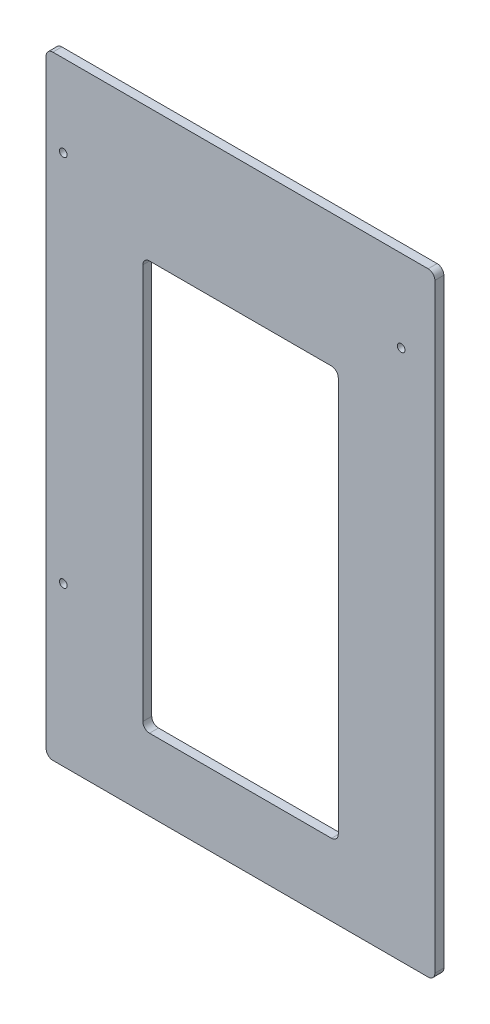
ISO-10303-21;
HEADER;
FILE_DESCRIPTION(('STEP AP214'),'2;1');
FILE_NAME('part.step','',(''),(''),'','','');
FILE_SCHEMA(('AUTOMOTIVE_DESIGN { 1 0 10303 214 1 1 1 1 }'));
ENDSEC;
DATA;
#1=APPLICATION_CONTEXT('core data for automotive mechanical design processes');
#2=APPLICATION_PROTOCOL_DEFINITION('international standard','automotive_design',2000,#1);
#3=PRODUCT_CONTEXT('',#1,'mechanical');
#4=PRODUCT('Part','Part','',(#3));
#5=PRODUCT_RELATED_PRODUCT_CATEGORY('part','',(#4));
#6=PRODUCT_DEFINITION_FORMATION('','',#4);
#7=PRODUCT_DEFINITION_CONTEXT('part definition',#1,'design');
#8=PRODUCT_DEFINITION('design','',#6,#7);
#9=PRODUCT_DEFINITION_SHAPE('','',#8);
#10=(LENGTH_UNIT() NAMED_UNIT(*) SI_UNIT(.MILLI.,.METRE.));
#11=(NAMED_UNIT(*) PLANE_ANGLE_UNIT() SI_UNIT($,.RADIAN.));
#12=(NAMED_UNIT(*) SI_UNIT($,.STERADIAN.) SOLID_ANGLE_UNIT());
#13=UNCERTAINTY_MEASURE_WITH_UNIT(LENGTH_MEASURE(1.E-05),#10,'distance_accuracy_value','');
#14=(GEOMETRIC_REPRESENTATION_CONTEXT(3) GLOBAL_UNCERTAINTY_ASSIGNED_CONTEXT((#13)) GLOBAL_UNIT_ASSIGNED_CONTEXT((#10,
#11,#12)) REPRESENTATION_CONTEXT('',''));
#15=CARTESIAN_POINT('',(0.,0.,0.));
#16=DIRECTION('',(0.,0.,1.));
#17=DIRECTION('',(1.,0.,0.));
#18=AXIS2_PLACEMENT_3D('',#15,#16,#17);
#19=CARTESIAN_POINT('',(0.,0.,0.));
#20=DIRECTION('',(0.,0.,-1.));
#21=DIRECTION('',(-1.,0.,0.));
#22=AXIS2_PLACEMENT_3D('',#19,#20,#21);
#23=PLANE('',#22);
#24=CARTESIAN_POINT('',(7.62,236.5,0.));
#25=DIRECTION('',(0.,0.,1.));
#26=DIRECTION('',(1.,0.,0.));
#27=AXIS2_PLACEMENT_3D('',#24,#25,#26);
#28=CIRCLE('',#27,1.7);
#29=CARTESIAN_POINT('',(9.32,236.5,0.));
#30=VERTEX_POINT('',#29);
#31=EDGE_CURVE('E511',#30,#30,#28,.T.);
#32=ORIENTED_EDGE('',*,*,#31,.T.);
#33=EDGE_LOOP('',(#32));
#34=FACE_BOUND('',#33,.T.);
#35=CARTESIAN_POINT('',(7.62,70.5,0.));
#36=DIRECTION('',(0.,0.,1.));
#37=DIRECTION('',(1.,0.,0.));
#38=AXIS2_PLACEMENT_3D('',#35,#36,#37);
#39=CIRCLE('',#38,1.7);
#40=CARTESIAN_POINT('',(9.32,70.5,0.));
#41=VERTEX_POINT('',#40);
#42=EDGE_CURVE('E524',#41,#41,#39,.T.);
#43=ORIENTED_EDGE('',*,*,#42,.T.);
#44=EDGE_LOOP('',(#43));
#45=FACE_BOUND('',#44,.T.);
#46=DIRECTION('',(1.,0.,0.));
#47=VECTOR('',#46,1.);
#48=CARTESIAN_POINT('',(0.,0.,0.));
#49=LINE('',#48,#47);
#50=CARTESIAN_POINT('',(3.,0.,0.));
#51=VERTEX_POINT('',#50);
#52=CARTESIAN_POINT('',(170.,0.,0.));
#53=VERTEX_POINT('',#52);
#54=EDGE_CURVE('E325',#51,#53,#49,.T.);
#55=ORIENTED_EDGE('',*,*,#54,.F.);
#56=CARTESIAN_POINT('',(3.,3.,0.));
#57=DIRECTION('',(0.,0.,-1.));
#58=DIRECTION('',(-1.,0.,0.));
#59=AXIS2_PLACEMENT_3D('',#56,#57,#58);
#60=CIRCLE('',#59,3.);
#61=CARTESIAN_POINT('',(0.,3.,0.));
#62=VERTEX_POINT('',#61);
#63=EDGE_CURVE('E228',#51,#62,#60,.T.);
#64=ORIENTED_EDGE('',*,*,#63,.T.);
#65=DIRECTION('',(0.,-1.,0.));
#66=VECTOR('',#65,1.);
#67=CARTESIAN_POINT('',(0.,0.,0.));
#68=LINE('',#67,#66);
#69=CARTESIAN_POINT('',(0.,270.,0.));
#70=VERTEX_POINT('',#69);
#71=EDGE_CURVE('E321',#70,#62,#68,.T.);
#72=ORIENTED_EDGE('',*,*,#71,.F.);
#73=CARTESIAN_POINT('',(3.,270.,0.));
#74=DIRECTION('',(0.,0.,-1.));
#75=DIRECTION('',(-1.,0.,0.));
#76=AXIS2_PLACEMENT_3D('',#73,#74,#75);
#77=CIRCLE('',#76,3.);
#78=CARTESIAN_POINT('',(3.,273.,0.));
#79=VERTEX_POINT('',#78);
#80=EDGE_CURVE('E219',#70,#79,#77,.T.);
#81=ORIENTED_EDGE('',*,*,#80,.T.);
#82=DIRECTION('',(-1.,0.,0.));
#83=VECTOR('',#82,1.);
#84=CARTESIAN_POINT('',(0.,273.,0.));
#85=LINE('',#84,#83);
#86=CARTESIAN_POINT('',(170.,273.,0.));
#87=VERTEX_POINT('',#86);
#88=EDGE_CURVE('E190',#87,#79,#85,.T.);
#89=ORIENTED_EDGE('',*,*,#88,.F.);
#90=CARTESIAN_POINT('',(170.,270.,0.));
#91=DIRECTION('',(0.,0.,-1.));
#92=DIRECTION('',(-1.,0.,0.));
#93=AXIS2_PLACEMENT_3D('',#90,#91,#92);
#94=CIRCLE('',#93,3.);
#95=CARTESIAN_POINT('',(173.,270.,0.));
#96=VERTEX_POINT('',#95);
#97=EDGE_CURVE('E222',#87,#96,#94,.T.);
#98=ORIENTED_EDGE('',*,*,#97,.T.);
#99=DIRECTION('',(0.,1.,0.));
#100=VECTOR('',#99,1.);
#101=CARTESIAN_POINT('',(173.,0.,0.));
#102=LINE('',#101,#100);
#103=CARTESIAN_POINT('',(173.,3.,0.));
#104=VERTEX_POINT('',#103);
#105=EDGE_CURVE('E328',#104,#96,#102,.T.);
#106=ORIENTED_EDGE('',*,*,#105,.F.);
#107=CARTESIAN_POINT('',(170.,3.,0.));
#108=DIRECTION('',(0.,0.,-1.));
#109=DIRECTION('',(-1.,0.,0.));
#110=AXIS2_PLACEMENT_3D('',#107,#108,#109);
#111=CIRCLE('',#110,3.);
#112=EDGE_CURVE('E225',#104,#53,#111,.T.);
#113=ORIENTED_EDGE('',*,*,#112,.T.);
#114=EDGE_LOOP('',(#55,#64,#72,#81,#89,#98,#106,#113));
#115=FACE_BOUND('',#114,.T.);
#116=DIRECTION('',(0.,1.,0.));
#117=VECTOR('',#116,1.);
#118=CARTESIAN_POINT('',(130.,32.,0.));
#119=LINE('',#118,#117);
#120=CARTESIAN_POINT('',(130.,35.,0.));
#121=VERTEX_POINT('',#120);
#122=CARTESIAN_POINT('',(130.,211.,0.));
#123=VERTEX_POINT('',#122);
#124=EDGE_CURVE('E299',#121,#123,#119,.T.);
#125=ORIENTED_EDGE('',*,*,#124,.T.);
#126=CARTESIAN_POINT('',(127.,211.,0.));
#127=DIRECTION('',(0.,0.,-1.));
#128=DIRECTION('',(-1.,0.,0.));
#129=AXIS2_PLACEMENT_3D('',#126,#127,#128);
#130=CIRCLE('',#129,3.);
#131=CARTESIAN_POINT('',(127.,214.,0.));
#132=VERTEX_POINT('',#131);
#133=EDGE_CURVE('E274',#123,#132,#130,.F.);
#134=ORIENTED_EDGE('',*,*,#133,.T.);
#135=DIRECTION('',(-1.,0.,0.));
#136=VECTOR('',#135,1.);
#137=CARTESIAN_POINT('',(43.,214.,0.));
#138=LINE('',#137,#136);
#139=CARTESIAN_POINT('',(46.,214.,0.));
#140=VERTEX_POINT('',#139);
#141=EDGE_CURVE('E159',#132,#140,#138,.T.);
#142=ORIENTED_EDGE('',*,*,#141,.T.);
#143=CARTESIAN_POINT('',(46.,211.,0.));
#144=DIRECTION('',(0.,0.,-1.));
#145=DIRECTION('',(-1.,0.,0.));
#146=AXIS2_PLACEMENT_3D('',#143,#144,#145);
#147=CIRCLE('',#146,3.);
#148=CARTESIAN_POINT('',(43.,211.,0.));
#149=VERTEX_POINT('',#148);
#150=EDGE_CURVE('E48',#140,#149,#147,.F.);
#151=ORIENTED_EDGE('',*,*,#150,.T.);
#152=DIRECTION('',(0.,-1.,0.));
#153=VECTOR('',#152,1.);
#154=CARTESIAN_POINT('',(43.,32.,0.));
#155=LINE('',#154,#153);
#156=CARTESIAN_POINT('',(43.,35.,0.));
#157=VERTEX_POINT('',#156);
#158=EDGE_CURVE('E157',#149,#157,#155,.T.);
#159=ORIENTED_EDGE('',*,*,#158,.T.);
#160=CARTESIAN_POINT('',(46.,35.,0.));
#161=DIRECTION('',(0.,0.,-1.));
#162=DIRECTION('',(-1.,0.,0.));
#163=AXIS2_PLACEMENT_3D('',#160,#161,#162);
#164=CIRCLE('',#163,3.);
#165=CARTESIAN_POINT('',(46.,32.,0.));
#166=VERTEX_POINT('',#165);
#167=EDGE_CURVE('E262',#157,#166,#164,.F.);
#168=ORIENTED_EDGE('',*,*,#167,.T.);
#169=DIRECTION('',(1.,0.,0.));
#170=VECTOR('',#169,1.);
#171=CARTESIAN_POINT('',(43.,32.,0.));
#172=LINE('',#171,#170);
#173=CARTESIAN_POINT('',(127.,32.,0.));
#174=VERTEX_POINT('',#173);
#175=EDGE_CURVE('E175',#166,#174,#172,.T.);
#176=ORIENTED_EDGE('',*,*,#175,.T.);
#177=CARTESIAN_POINT('',(127.,35.,0.));
#178=DIRECTION('',(0.,0.,-1.));
#179=DIRECTION('',(-1.,0.,0.));
#180=AXIS2_PLACEMENT_3D('',#177,#178,#179);
#181=CIRCLE('',#180,3.);
#182=EDGE_CURVE('E268',#174,#121,#181,.F.);
#183=ORIENTED_EDGE('',*,*,#182,.T.);
#184=EDGE_LOOP('',(#125,#134,#142,#151,#159,#168,#176,#183));
#185=FACE_BOUND('',#184,.T.);
#186=CARTESIAN_POINT('',(158.,236.5,0.));
#187=DIRECTION('',(0.,0.,1.));
#188=DIRECTION('',(1.,0.,0.));
#189=AXIS2_PLACEMENT_3D('',#186,#187,#188);
#190=CIRCLE('',#189,1.70000000000001);
#191=CARTESIAN_POINT('',(159.7,236.5,0.));
#192=VERTEX_POINT('',#191);
#193=EDGE_CURVE('E176',#192,#192,#190,.T.);
#194=ORIENTED_EDGE('',*,*,#193,.T.);
#195=EDGE_LOOP('',(#194));
#196=FACE_BOUND('',#195,.T.);
#197=ADVANCED_FACE('F39',(#34,#45,#115,#185,#196),#23,.T.);
#198=CARTESIAN_POINT('',(0.,0.,4.));
#199=DIRECTION('',(0.,0.,-1.));
#200=DIRECTION('',(-1.,0.,0.));
#201=AXIS2_PLACEMENT_3D('',#198,#199,#200);
#202=PLANE('',#201);
#203=CARTESIAN_POINT('',(7.62,236.5,4.));
#204=DIRECTION('',(0.,0.,1.));
#205=DIRECTION('',(1.,0.,0.));
#206=AXIS2_PLACEMENT_3D('',#203,#204,#205);
#207=CIRCLE('',#206,1.69999999999999);
#208=CARTESIAN_POINT('',(9.31999999999999,236.5,4.));
#209=VERTEX_POINT('',#208);
#210=EDGE_CURVE('E514',#209,#209,#207,.T.);
#211=ORIENTED_EDGE('',*,*,#210,.F.);
#212=EDGE_LOOP('',(#211));
#213=FACE_BOUND('',#212,.T.);
#214=CARTESIAN_POINT('',(7.62,70.5,4.));
#215=DIRECTION('',(0.,0.,1.));
#216=DIRECTION('',(1.,0.,0.));
#217=AXIS2_PLACEMENT_3D('',#214,#215,#216);
#218=CIRCLE('',#217,1.69999999999999);
#219=CARTESIAN_POINT('',(9.31999999999999,70.5,4.));
#220=VERTEX_POINT('',#219);
#221=EDGE_CURVE('E518',#220,#220,#218,.T.);
#222=ORIENTED_EDGE('',*,*,#221,.F.);
#223=EDGE_LOOP('',(#222));
#224=FACE_BOUND('',#223,.T.);
#225=CARTESIAN_POINT('',(158.,236.5,4.));
#226=DIRECTION('',(0.,0.,1.));
#227=DIRECTION('',(1.,0.,0.));
#228=AXIS2_PLACEMENT_3D('',#225,#226,#227);
#229=CIRCLE('',#228,1.69999999999998);
#230=CARTESIAN_POINT('',(159.7,236.5,4.));
#231=VERTEX_POINT('',#230);
#232=EDGE_CURVE('E528',#231,#231,#229,.T.);
#233=ORIENTED_EDGE('',*,*,#232,.F.);
#234=EDGE_LOOP('',(#233));
#235=FACE_BOUND('',#234,.T.);
#236=DIRECTION('',(0.,-1.,0.));
#237=VECTOR('',#236,1.);
#238=CARTESIAN_POINT('',(0.,0.,4.));
#239=LINE('',#238,#237);
#240=CARTESIAN_POINT('',(0.,270.,4.));
#241=VERTEX_POINT('',#240);
#242=CARTESIAN_POINT('',(0.,3.,4.));
#243=VERTEX_POINT('',#242);
#244=EDGE_CURVE('E311',#241,#243,#239,.T.);
#245=ORIENTED_EDGE('',*,*,#244,.T.);
#246=CARTESIAN_POINT('',(3.,3.,4.));
#247=DIRECTION('',(0.,0.,-1.));
#248=DIRECTION('',(-1.,0.,0.));
#249=AXIS2_PLACEMENT_3D('',#246,#247,#248);
#250=CIRCLE('',#249,3.);
#251=CARTESIAN_POINT('',(3.,0.,4.));
#252=VERTEX_POINT('',#251);
#253=EDGE_CURVE('E246',#243,#252,#250,.F.);
#254=ORIENTED_EDGE('',*,*,#253,.T.);
#255=DIRECTION('',(1.,0.,0.));
#256=VECTOR('',#255,1.);
#257=CARTESIAN_POINT('',(0.,0.,4.));
#258=LINE('',#257,#256);
#259=CARTESIAN_POINT('',(170.,0.,4.));
#260=VERTEX_POINT('',#259);
#261=EDGE_CURVE('E315',#252,#260,#258,.T.);
#262=ORIENTED_EDGE('',*,*,#261,.T.);
#263=CARTESIAN_POINT('',(170.,3.,4.));
#264=DIRECTION('',(0.,0.,-1.));
#265=DIRECTION('',(-1.,0.,0.));
#266=AXIS2_PLACEMENT_3D('',#263,#264,#265);
#267=CIRCLE('',#266,3.);
#268=CARTESIAN_POINT('',(173.,3.,4.));
#269=VERTEX_POINT('',#268);
#270=EDGE_CURVE('E243',#260,#269,#267,.F.);
#271=ORIENTED_EDGE('',*,*,#270,.T.);
#272=DIRECTION('',(0.,1.,0.));
#273=VECTOR('',#272,1.);
#274=CARTESIAN_POINT('',(173.,0.,4.));
#275=LINE('',#274,#273);
#276=CARTESIAN_POINT('',(173.,270.,4.));
#277=VERTEX_POINT('',#276);
#278=EDGE_CURVE('E187',#269,#277,#275,.T.);
#279=ORIENTED_EDGE('',*,*,#278,.T.);
#280=CARTESIAN_POINT('',(170.,270.,4.));
#281=DIRECTION('',(0.,0.,-1.));
#282=DIRECTION('',(-1.,0.,0.));
#283=AXIS2_PLACEMENT_3D('',#280,#281,#282);
#284=CIRCLE('',#283,3.);
#285=CARTESIAN_POINT('',(170.,273.,4.));
#286=VERTEX_POINT('',#285);
#287=EDGE_CURVE('E62',#277,#286,#284,.F.);
#288=ORIENTED_EDGE('',*,*,#287,.T.);
#289=DIRECTION('',(-1.,0.,0.));
#290=VECTOR('',#289,1.);
#291=CARTESIAN_POINT('',(0.,273.,4.));
#292=LINE('',#291,#290);
#293=CARTESIAN_POINT('',(3.,273.,4.));
#294=VERTEX_POINT('',#293);
#295=EDGE_CURVE('E181',#286,#294,#292,.T.);
#296=ORIENTED_EDGE('',*,*,#295,.T.);
#297=CARTESIAN_POINT('',(3.,270.,4.));
#298=DIRECTION('',(0.,0.,-1.));
#299=DIRECTION('',(-1.,0.,0.));
#300=AXIS2_PLACEMENT_3D('',#297,#298,#299);
#301=CIRCLE('',#300,3.);
#302=EDGE_CURVE('E238',#294,#241,#301,.F.);
#303=ORIENTED_EDGE('',*,*,#302,.T.);
#304=EDGE_LOOP('',(#245,#254,#262,#271,#279,#288,#296,#303));
#305=FACE_BOUND('',#304,.T.);
#306=DIRECTION('',(0.,-1.,0.));
#307=VECTOR('',#306,1.);
#308=CARTESIAN_POINT('',(43.,32.,4.));
#309=LINE('',#308,#307);
#310=CARTESIAN_POINT('',(43.,211.,4.));
#311=VERTEX_POINT('',#310);
#312=CARTESIAN_POINT('',(43.,35.,4.));
#313=VERTEX_POINT('',#312);
#314=EDGE_CURVE('E303',#311,#313,#309,.T.);
#315=ORIENTED_EDGE('',*,*,#314,.F.);
#316=CARTESIAN_POINT('',(46.,211.,4.));
#317=DIRECTION('',(0.,0.,-1.));
#318=DIRECTION('',(-1.,0.,0.));
#319=AXIS2_PLACEMENT_3D('',#316,#317,#318);
#320=CIRCLE('',#319,3.);
#321=CARTESIAN_POINT('',(46.,214.,4.));
#322=VERTEX_POINT('',#321);
#323=EDGE_CURVE('E11',#311,#322,#320,.T.);
#324=ORIENTED_EDGE('',*,*,#323,.T.);
#325=DIRECTION('',(-1.,0.,0.));
#326=VECTOR('',#325,1.);
#327=CARTESIAN_POINT('',(43.,214.,4.));
#328=LINE('',#327,#326);
#329=CARTESIAN_POINT('',(127.,214.,4.));
#330=VERTEX_POINT('',#329);
#331=EDGE_CURVE('E287',#330,#322,#328,.T.);
#332=ORIENTED_EDGE('',*,*,#331,.F.);
#333=CARTESIAN_POINT('',(127.,211.,4.));
#334=DIRECTION('',(0.,0.,-1.));
#335=DIRECTION('',(-1.,0.,0.));
#336=AXIS2_PLACEMENT_3D('',#333,#334,#335);
#337=CIRCLE('',#336,3.);
#338=CARTESIAN_POINT('',(130.,211.,4.));
#339=VERTEX_POINT('',#338);
#340=EDGE_CURVE('E165',#330,#339,#337,.T.);
#341=ORIENTED_EDGE('',*,*,#340,.T.);
#342=DIRECTION('',(0.,1.,0.));
#343=VECTOR('',#342,1.);
#344=CARTESIAN_POINT('',(130.,32.,4.));
#345=LINE('',#344,#343);
#346=CARTESIAN_POINT('',(130.,35.,4.));
#347=VERTEX_POINT('',#346);
#348=EDGE_CURVE('E284',#347,#339,#345,.T.);
#349=ORIENTED_EDGE('',*,*,#348,.F.);
#350=CARTESIAN_POINT('',(127.,35.,4.));
#351=DIRECTION('',(0.,0.,-1.));
#352=DIRECTION('',(-1.,0.,0.));
#353=AXIS2_PLACEMENT_3D('',#350,#351,#352);
#354=CIRCLE('',#353,3.);
#355=CARTESIAN_POINT('',(127.,32.,4.));
#356=VERTEX_POINT('',#355);
#357=EDGE_CURVE('E271',#347,#356,#354,.T.);
#358=ORIENTED_EDGE('',*,*,#357,.T.);
#359=DIRECTION('',(1.,0.,0.));
#360=VECTOR('',#359,1.);
#361=CARTESIAN_POINT('',(43.,32.,4.));
#362=LINE('',#361,#360);
#363=CARTESIAN_POINT('',(46.,32.,4.));
#364=VERTEX_POINT('',#363);
#365=EDGE_CURVE('E296',#364,#356,#362,.T.);
#366=ORIENTED_EDGE('',*,*,#365,.F.);
#367=CARTESIAN_POINT('',(46.,35.,4.));
#368=DIRECTION('',(0.,0.,-1.));
#369=DIRECTION('',(-1.,0.,0.));
#370=AXIS2_PLACEMENT_3D('',#367,#368,#369);
#371=CIRCLE('',#370,3.);
#372=EDGE_CURVE('E265',#364,#313,#371,.T.);
#373=ORIENTED_EDGE('',*,*,#372,.T.);
#374=EDGE_LOOP('',(#315,#324,#332,#341,#349,#358,#366,#373));
#375=FACE_BOUND('',#374,.T.);
#376=ADVANCED_FACE('F283',(#213,#224,#235,#305,#375),#202,.F.);
#377=CARTESIAN_POINT('',(0.,0.,4.));
#378=DIRECTION('',(1.,0.,0.));
#379=DIRECTION('',(0.,0.,-1.));
#380=AXIS2_PLACEMENT_3D('',#377,#378,#379);
#381=PLANE('',#380);
#382=ORIENTED_EDGE('',*,*,#71,.T.);
#383=DIRECTION('',(0.,0.,-1.));
#384=VECTOR('',#383,1.);
#385=CARTESIAN_POINT('',(0.,3.,4.));
#386=LINE('',#385,#384);
#387=EDGE_CURVE('E235',#62,#243,#386,.F.);
#388=ORIENTED_EDGE('',*,*,#387,.T.);
#389=ORIENTED_EDGE('',*,*,#244,.F.);
#390=DIRECTION('',(0.,0.,-1.));
#391=VECTOR('',#390,1.);
#392=CARTESIAN_POINT('',(0.,270.,4.));
#393=LINE('',#392,#391);
#394=EDGE_CURVE('E231',#241,#70,#393,.T.);
#395=ORIENTED_EDGE('',*,*,#394,.T.);
#396=EDGE_LOOP('',(#382,#388,#389,#395));
#397=FACE_BOUND('',#396,.T.);
#398=ADVANCED_FACE('F345',(#397),#381,.F.);
#399=CARTESIAN_POINT('',(0.,0.,4.));
#400=DIRECTION('',(0.,1.,0.));
#401=DIRECTION('',(0.,0.,1.));
#402=AXIS2_PLACEMENT_3D('',#399,#400,#401);
#403=PLANE('',#402);
#404=ORIENTED_EDGE('',*,*,#261,.F.);
#405=DIRECTION('',(0.,0.,-1.));
#406=VECTOR('',#405,1.);
#407=CARTESIAN_POINT('',(3.,0.,4.));
#408=LINE('',#407,#406);
#409=EDGE_CURVE('E215',#252,#51,#408,.T.);
#410=ORIENTED_EDGE('',*,*,#409,.T.);
#411=ORIENTED_EDGE('',*,*,#54,.T.);
#412=DIRECTION('',(0.,0.,-1.));
#413=VECTOR('',#412,1.);
#414=CARTESIAN_POINT('',(170.,0.,4.));
#415=LINE('',#414,#413);
#416=EDGE_CURVE('E212',#53,#260,#415,.F.);
#417=ORIENTED_EDGE('',*,*,#416,.T.);
#418=EDGE_LOOP('',(#404,#410,#411,#417));
#419=FACE_BOUND('',#418,.T.);
#420=ADVANCED_FACE('F354',(#419),#403,.F.);
#421=CARTESIAN_POINT('',(173.,0.,4.));
#422=DIRECTION('',(-1.,0.,0.));
#423=DIRECTION('',(0.,0.,1.));
#424=AXIS2_PLACEMENT_3D('',#421,#422,#423);
#425=PLANE('',#424);
#426=ORIENTED_EDGE('',*,*,#278,.F.);
#427=DIRECTION('',(0.,0.,-1.));
#428=VECTOR('',#427,1.);
#429=CARTESIAN_POINT('',(173.,3.,4.));
#430=LINE('',#429,#428);
#431=EDGE_CURVE('E252',#269,#104,#430,.T.);
#432=ORIENTED_EDGE('',*,*,#431,.T.);
#433=ORIENTED_EDGE('',*,*,#105,.T.);
#434=DIRECTION('',(0.,0.,-1.));
#435=VECTOR('',#434,1.);
#436=CARTESIAN_POINT('',(173.,270.,4.));
#437=LINE('',#436,#435);
#438=EDGE_CURVE('E249',#96,#277,#437,.F.);
#439=ORIENTED_EDGE('',*,*,#438,.T.);
#440=EDGE_LOOP('',(#426,#432,#433,#439));
#441=FACE_BOUND('',#440,.T.);
#442=ADVANCED_FACE('F361',(#441),#425,.F.);
#443=CARTESIAN_POINT('',(0.,273.,4.));
#444=DIRECTION('',(0.,-1.,0.));
#445=DIRECTION('',(0.,0.,-1.));
#446=AXIS2_PLACEMENT_3D('',#443,#444,#445);
#447=PLANE('',#446);
#448=ORIENTED_EDGE('',*,*,#295,.F.);
#449=DIRECTION('',(0.,0.,-1.));
#450=VECTOR('',#449,1.);
#451=CARTESIAN_POINT('',(170.,273.,4.));
#452=LINE('',#451,#450);
#453=EDGE_CURVE('E258',#286,#87,#452,.T.);
#454=ORIENTED_EDGE('',*,*,#453,.T.);
#455=ORIENTED_EDGE('',*,*,#88,.T.);
#456=DIRECTION('',(0.,0.,-1.));
#457=VECTOR('',#456,1.);
#458=CARTESIAN_POINT('',(3.,273.,4.));
#459=LINE('',#458,#457);
#460=EDGE_CURVE('E55',#79,#294,#459,.F.);
#461=ORIENTED_EDGE('',*,*,#460,.T.);
#462=EDGE_LOOP('',(#448,#454,#455,#461));
#463=FACE_BOUND('',#462,.T.);
#464=ADVANCED_FACE('F336',(#463),#447,.F.);
#465=CARTESIAN_POINT('',(43.,32.,4.));
#466=DIRECTION('',(1.,0.,0.));
#467=DIRECTION('',(0.,0.,-1.));
#468=AXIS2_PLACEMENT_3D('',#465,#466,#467);
#469=PLANE('',#468);
#470=ORIENTED_EDGE('',*,*,#314,.T.);
#471=DIRECTION('',(0.,0.,-1.));
#472=VECTOR('',#471,1.);
#473=CARTESIAN_POINT('',(43.,35.,0.));
#474=LINE('',#473,#472);
#475=EDGE_CURVE('E173',#313,#157,#474,.T.);
#476=ORIENTED_EDGE('',*,*,#475,.T.);
#477=ORIENTED_EDGE('',*,*,#158,.F.);
#478=DIRECTION('',(0.,0.,-1.));
#479=VECTOR('',#478,1.);
#480=CARTESIAN_POINT('',(43.,211.,4.));
#481=LINE('',#480,#479);
#482=EDGE_CURVE('E170',#149,#311,#481,.F.);
#483=ORIENTED_EDGE('',*,*,#482,.T.);
#484=EDGE_LOOP('',(#470,#476,#477,#483));
#485=FACE_BOUND('',#484,.T.);
#486=ADVANCED_FACE('F169',(#485),#469,.T.);
#487=CARTESIAN_POINT('',(43.,32.,4.));
#488=DIRECTION('',(0.,1.,0.));
#489=DIRECTION('',(0.,0.,1.));
#490=AXIS2_PLACEMENT_3D('',#487,#488,#489);
#491=PLANE('',#490);
#492=ORIENTED_EDGE('',*,*,#175,.F.);
#493=DIRECTION('',(0.,0.,-1.));
#494=VECTOR('',#493,1.);
#495=CARTESIAN_POINT('',(46.,32.,4.));
#496=LINE('',#495,#494);
#497=EDGE_CURVE('E196',#166,#364,#496,.F.);
#498=ORIENTED_EDGE('',*,*,#497,.T.);
#499=ORIENTED_EDGE('',*,*,#365,.T.);
#500=DIRECTION('',(0.,0.,-1.));
#501=VECTOR('',#500,1.);
#502=CARTESIAN_POINT('',(127.,32.,0.));
#503=LINE('',#502,#501);
#504=EDGE_CURVE('E185',#356,#174,#503,.T.);
#505=ORIENTED_EDGE('',*,*,#504,.T.);
#506=EDGE_LOOP('',(#492,#498,#499,#505));
#507=FACE_BOUND('',#506,.T.);
#508=ADVANCED_FACE('F424',(#507),#491,.T.);
#509=CARTESIAN_POINT('',(130.,32.,4.));
#510=DIRECTION('',(-1.,0.,0.));
#511=DIRECTION('',(0.,0.,1.));
#512=AXIS2_PLACEMENT_3D('',#509,#510,#511);
#513=PLANE('',#512);
#514=ORIENTED_EDGE('',*,*,#124,.F.);
#515=DIRECTION('',(0.,0.,-1.));
#516=VECTOR('',#515,1.);
#517=CARTESIAN_POINT('',(130.,35.,4.));
#518=LINE('',#517,#516);
#519=EDGE_CURVE('E203',#121,#347,#518,.F.);
#520=ORIENTED_EDGE('',*,*,#519,.T.);
#521=ORIENTED_EDGE('',*,*,#348,.T.);
#522=DIRECTION('',(0.,0.,-1.));
#523=VECTOR('',#522,1.);
#524=CARTESIAN_POINT('',(130.,211.,0.));
#525=LINE('',#524,#523);
#526=EDGE_CURVE('E199',#339,#123,#525,.T.);
#527=ORIENTED_EDGE('',*,*,#526,.T.);
#528=EDGE_LOOP('',(#514,#520,#521,#527));
#529=FACE_BOUND('',#528,.T.);
#530=ADVANCED_FACE('F293',(#529),#513,.T.);
#531=CARTESIAN_POINT('',(43.,214.,4.));
#532=DIRECTION('',(0.,-1.,0.));
#533=DIRECTION('',(0.,0.,-1.));
#534=AXIS2_PLACEMENT_3D('',#531,#532,#533);
#535=PLANE('',#534);
#536=ORIENTED_EDGE('',*,*,#141,.F.);
#537=DIRECTION('',(0.,0.,-1.));
#538=VECTOR('',#537,1.);
#539=CARTESIAN_POINT('',(127.,214.,4.));
#540=LINE('',#539,#538);
#541=EDGE_CURVE('E209',#132,#330,#540,.F.);
#542=ORIENTED_EDGE('',*,*,#541,.T.);
#543=ORIENTED_EDGE('',*,*,#331,.T.);
#544=DIRECTION('',(0.,0.,-1.));
#545=VECTOR('',#544,1.);
#546=CARTESIAN_POINT('',(46.,214.,0.));
#547=LINE('',#546,#545);
#548=EDGE_CURVE('E206',#322,#140,#547,.T.);
#549=ORIENTED_EDGE('',*,*,#548,.T.);
#550=EDGE_LOOP('',(#536,#542,#543,#549));
#551=FACE_BOUND('',#550,.T.);
#552=ADVANCED_FACE('F301',(#551),#535,.T.);
#553=CARTESIAN_POINT('',(46.,35.,4.));
#554=DIRECTION('',(0.,0.,1.));
#555=DIRECTION('',(1.,0.,0.));
#556=AXIS2_PLACEMENT_3D('',#553,#554,#555);
#557=CYLINDRICAL_SURFACE('',#556,3.);
#558=ORIENTED_EDGE('',*,*,#372,.F.);
#559=ORIENTED_EDGE('',*,*,#497,.F.);
#560=ORIENTED_EDGE('',*,*,#167,.F.);
#561=ORIENTED_EDGE('',*,*,#475,.F.);
#562=EDGE_LOOP('',(#558,#559,#560,#561));
#563=FACE_BOUND('',#562,.T.);
#564=ADVANCED_FACE('F384',(#563),#557,.F.);
#565=CARTESIAN_POINT('',(127.,35.,4.));
#566=DIRECTION('',(0.,0.,1.));
#567=DIRECTION('',(1.,0.,0.));
#568=AXIS2_PLACEMENT_3D('',#565,#566,#567);
#569=CYLINDRICAL_SURFACE('',#568,3.);
#570=ORIENTED_EDGE('',*,*,#357,.F.);
#571=ORIENTED_EDGE('',*,*,#519,.F.);
#572=ORIENTED_EDGE('',*,*,#182,.F.);
#573=ORIENTED_EDGE('',*,*,#504,.F.);
#574=EDGE_LOOP('',(#570,#571,#572,#573));
#575=FACE_BOUND('',#574,.T.);
#576=ADVANCED_FACE('F387',(#575),#569,.F.);
#577=CARTESIAN_POINT('',(127.,211.,4.));
#578=DIRECTION('',(0.,0.,1.));
#579=DIRECTION('',(1.,0.,0.));
#580=AXIS2_PLACEMENT_3D('',#577,#578,#579);
#581=CYLINDRICAL_SURFACE('',#580,3.);
#582=ORIENTED_EDGE('',*,*,#340,.F.);
#583=ORIENTED_EDGE('',*,*,#541,.F.);
#584=ORIENTED_EDGE('',*,*,#133,.F.);
#585=ORIENTED_EDGE('',*,*,#526,.F.);
#586=EDGE_LOOP('',(#582,#583,#584,#585));
#587=FACE_BOUND('',#586,.T.);
#588=ADVANCED_FACE('F298',(#587),#581,.F.);
#589=CARTESIAN_POINT('',(46.,211.,4.));
#590=DIRECTION('',(0.,0.,1.));
#591=DIRECTION('',(1.,0.,0.));
#592=AXIS2_PLACEMENT_3D('',#589,#590,#591);
#593=CYLINDRICAL_SURFACE('',#592,3.);
#594=ORIENTED_EDGE('',*,*,#323,.F.);
#595=ORIENTED_EDGE('',*,*,#482,.F.);
#596=ORIENTED_EDGE('',*,*,#150,.F.);
#597=ORIENTED_EDGE('',*,*,#548,.F.);
#598=EDGE_LOOP('',(#594,#595,#596,#597));
#599=FACE_BOUND('',#598,.T.);
#600=ADVANCED_FACE('F179',(#599),#593,.F.);
#601=CARTESIAN_POINT('',(3.,3.,4.));
#602=DIRECTION('',(0.,0.,-1.));
#603=DIRECTION('',(-1.,0.,0.));
#604=AXIS2_PLACEMENT_3D('',#601,#602,#603);
#605=CYLINDRICAL_SURFACE('',#604,3.);
#606=ORIENTED_EDGE('',*,*,#253,.F.);
#607=ORIENTED_EDGE('',*,*,#387,.F.);
#608=ORIENTED_EDGE('',*,*,#63,.F.);
#609=ORIENTED_EDGE('',*,*,#409,.F.);
#610=EDGE_LOOP('',(#606,#607,#608,#609));
#611=FACE_BOUND('',#610,.T.);
#612=ADVANCED_FACE('F349',(#611),#605,.T.);
#613=CARTESIAN_POINT('',(170.,3.,4.));
#614=DIRECTION('',(0.,0.,-1.));
#615=DIRECTION('',(-1.,0.,0.));
#616=AXIS2_PLACEMENT_3D('',#613,#614,#615);
#617=CYLINDRICAL_SURFACE('',#616,3.);
#618=ORIENTED_EDGE('',*,*,#270,.F.);
#619=ORIENTED_EDGE('',*,*,#416,.F.);
#620=ORIENTED_EDGE('',*,*,#112,.F.);
#621=ORIENTED_EDGE('',*,*,#431,.F.);
#622=EDGE_LOOP('',(#618,#619,#620,#621));
#623=FACE_BOUND('',#622,.T.);
#624=ADVANCED_FACE('F358',(#623),#617,.T.);
#625=CARTESIAN_POINT('',(170.,270.,4.));
#626=DIRECTION('',(0.,0.,-1.));
#627=DIRECTION('',(-1.,0.,0.));
#628=AXIS2_PLACEMENT_3D('',#625,#626,#627);
#629=CYLINDRICAL_SURFACE('',#628,3.);
#630=ORIENTED_EDGE('',*,*,#287,.F.);
#631=ORIENTED_EDGE('',*,*,#438,.F.);
#632=ORIENTED_EDGE('',*,*,#97,.F.);
#633=ORIENTED_EDGE('',*,*,#453,.F.);
#634=EDGE_LOOP('',(#630,#631,#632,#633));
#635=FACE_BOUND('',#634,.T.);
#636=ADVANCED_FACE('F363',(#635),#629,.T.);
#637=CARTESIAN_POINT('',(3.,270.,4.));
#638=DIRECTION('',(0.,0.,-1.));
#639=DIRECTION('',(-1.,0.,0.));
#640=AXIS2_PLACEMENT_3D('',#637,#638,#639);
#641=CYLINDRICAL_SURFACE('',#640,3.);
#642=ORIENTED_EDGE('',*,*,#302,.F.);
#643=ORIENTED_EDGE('',*,*,#460,.F.);
#644=ORIENTED_EDGE('',*,*,#80,.F.);
#645=ORIENTED_EDGE('',*,*,#394,.F.);
#646=EDGE_LOOP('',(#642,#643,#644,#645));
#647=FACE_BOUND('',#646,.T.);
#648=ADVANCED_FACE('F41',(#647),#641,.T.);
#649=CARTESIAN_POINT('',(158.,236.5,4.));
#650=DIRECTION('',(0.,0.,1.));
#651=DIRECTION('',(1.,0.,0.));
#652=AXIS2_PLACEMENT_3D('',#649,#650,#651);
#653=CYLINDRICAL_SURFACE('',#652,1.69999999999999);
#654=ORIENTED_EDGE('',*,*,#193,.F.);
#655=EDGE_LOOP('',(#654));
#656=FACE_BOUND('',#655,.T.);
#657=ORIENTED_EDGE('',*,*,#232,.T.);
#658=EDGE_LOOP('',(#657));
#659=FACE_BOUND('',#658,.T.);
#660=ADVANCED_FACE('F403',(#656,#659),#653,.F.);
#661=CARTESIAN_POINT('',(7.62,70.5,4.));
#662=DIRECTION('',(0.,0.,1.));
#663=DIRECTION('',(1.,0.,0.));
#664=AXIS2_PLACEMENT_3D('',#661,#662,#663);
#665=CYLINDRICAL_SURFACE('',#664,1.69999999999999);
#666=ORIENTED_EDGE('',*,*,#42,.F.);
#667=EDGE_LOOP('',(#666));
#668=FACE_BOUND('',#667,.T.);
#669=ORIENTED_EDGE('',*,*,#221,.T.);
#670=EDGE_LOOP('',(#669));
#671=FACE_BOUND('',#670,.T.);
#672=ADVANCED_FACE('F407',(#668,#671),#665,.F.);
#673=CARTESIAN_POINT('',(7.62,236.5,4.));
#674=DIRECTION('',(0.,0.,1.));
#675=DIRECTION('',(1.,0.,0.));
#676=AXIS2_PLACEMENT_3D('',#673,#674,#675);
#677=CYLINDRICAL_SURFACE('',#676,1.69999999999999);
#678=ORIENTED_EDGE('',*,*,#31,.F.);
#679=EDGE_LOOP('',(#678));
#680=FACE_BOUND('',#679,.T.);
#681=ORIENTED_EDGE('',*,*,#210,.T.);
#682=EDGE_LOOP('',(#681));
#683=FACE_BOUND('',#682,.T.);
#684=ADVANCED_FACE('F413',(#680,#683),#677,.F.);
#685=CLOSED_SHELL('',(#197,#376,#398,#420,#442,#464,#486,#508,#530,#552,#564,#576,#588,#600,
#612,#624,#636,#648,#660,#672,#684));
#686=MANIFOLD_SOLID_BREP('B2',#685);
#687=ADVANCED_BREP_SHAPE_REPRESENTATION('',(#18,#686),#14);
#688=SHAPE_DEFINITION_REPRESENTATION(#9,#687);
ENDSEC;
END-ISO-10303-21;
